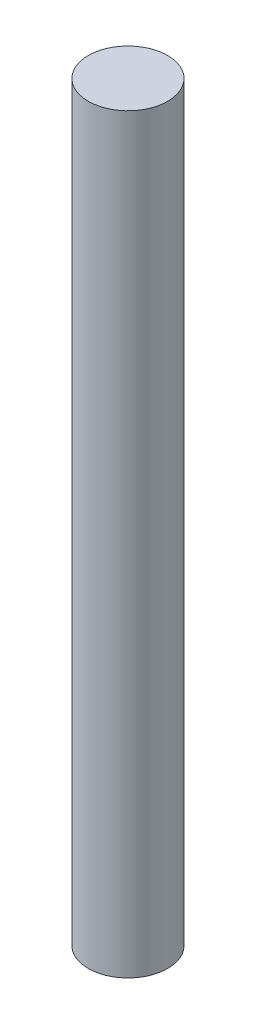
ISO-10303-21;
HEADER;
FILE_DESCRIPTION(('STEP AP214'),'2;1');
FILE_NAME('part.step','',(''),(''),'','','');
FILE_SCHEMA(('AUTOMOTIVE_DESIGN { 1 0 10303 214 1 1 1 1 }'));
ENDSEC;
DATA;
#1=APPLICATION_CONTEXT('core data for automotive mechanical design processes');
#2=APPLICATION_PROTOCOL_DEFINITION('international standard','automotive_design',2000,#1);
#3=PRODUCT_CONTEXT('',#1,'mechanical');
#4=PRODUCT('Part','Part','',(#3));
#5=PRODUCT_RELATED_PRODUCT_CATEGORY('part','',(#4));
#6=PRODUCT_DEFINITION_FORMATION('','',#4);
#7=PRODUCT_DEFINITION_CONTEXT('part definition',#1,'design');
#8=PRODUCT_DEFINITION('design','',#6,#7);
#9=PRODUCT_DEFINITION_SHAPE('','',#8);
#10=(LENGTH_UNIT() NAMED_UNIT(*) SI_UNIT(.MILLI.,.METRE.));
#11=(NAMED_UNIT(*) PLANE_ANGLE_UNIT() SI_UNIT($,.RADIAN.));
#12=(NAMED_UNIT(*) SI_UNIT($,.STERADIAN.) SOLID_ANGLE_UNIT());
#13=UNCERTAINTY_MEASURE_WITH_UNIT(LENGTH_MEASURE(1.E-05),#10,'distance_accuracy_value','');
#14=(GEOMETRIC_REPRESENTATION_CONTEXT(3) GLOBAL_UNCERTAINTY_ASSIGNED_CONTEXT((#13)) GLOBAL_UNIT_ASSIGNED_CONTEXT((#10,
#11,#12)) REPRESENTATION_CONTEXT('',''));
#15=CARTESIAN_POINT('',(0.,0.,0.));
#16=DIRECTION('',(0.,0.,1.));
#17=DIRECTION('',(1.,0.,0.));
#18=AXIS2_PLACEMENT_3D('',#15,#16,#17);
#19=CARTESIAN_POINT('',(0.,30.,0.));
#20=DIRECTION('',(0.,-1.,0.));
#21=DIRECTION('',(0.,0.,-1.));
#22=AXIS2_PLACEMENT_3D('',#19,#20,#21);
#23=CYLINDRICAL_SURFACE('',#22,1.585);
#24=CARTESIAN_POINT('',(0.,30.,0.));
#25=DIRECTION('',(0.,1.,0.));
#26=DIRECTION('',(0.,0.,1.));
#27=AXIS2_PLACEMENT_3D('',#24,#25,#26);
#28=CIRCLE('',#27,1.585);
#29=CARTESIAN_POINT('',(0.,30.,1.585));
#30=VERTEX_POINT('',#29);
#31=EDGE_CURVE('E10',#30,#30,#28,.T.);
#32=ORIENTED_EDGE('',*,*,#31,.F.);
#33=EDGE_LOOP('',(#32));
#34=FACE_BOUND('',#33,.T.);
#35=CARTESIAN_POINT('',(0.,0.,0.));
#36=DIRECTION('',(0.,1.,0.));
#37=DIRECTION('',(0.,0.,1.));
#38=AXIS2_PLACEMENT_3D('',#35,#36,#37);
#39=CIRCLE('',#38,1.585);
#40=CARTESIAN_POINT('',(0.,0.,1.585));
#41=VERTEX_POINT('',#40);
#42=EDGE_CURVE('E34',#41,#41,#39,.T.);
#43=ORIENTED_EDGE('',*,*,#42,.T.);
#44=EDGE_LOOP('',(#43));
#45=FACE_BOUND('',#44,.T.);
#46=ADVANCED_FACE('F31',(#34,#45),#23,.T.);
#47=CARTESIAN_POINT('',(0.,30.,0.));
#48=DIRECTION('',(0.,1.,0.));
#49=DIRECTION('',(0.,0.,1.));
#50=AXIS2_PLACEMENT_3D('',#47,#48,#49);
#51=PLANE('',#50);
#52=ORIENTED_EDGE('',*,*,#31,.T.);
#53=EDGE_LOOP('',(#52));
#54=FACE_BOUND('',#53,.T.);
#55=ADVANCED_FACE('F46',(#54),#51,.T.);
#56=CARTESIAN_POINT('',(0.,0.,0.));
#57=DIRECTION('',(0.,1.,0.));
#58=DIRECTION('',(0.,0.,1.));
#59=AXIS2_PLACEMENT_3D('',#56,#57,#58);
#60=PLANE('',#59);
#61=ORIENTED_EDGE('',*,*,#42,.F.);
#62=EDGE_LOOP('',(#61));
#63=FACE_BOUND('',#62,.T.);
#64=ADVANCED_FACE('F44',(#63),#60,.F.);
#65=CLOSED_SHELL('',(#46,#55,#64));
#66=MANIFOLD_SOLID_BREP('B2',#65);
#67=ADVANCED_BREP_SHAPE_REPRESENTATION('',(#18,#66),#14);
#68=SHAPE_DEFINITION_REPRESENTATION(#9,#67);
ENDSEC;
END-ISO-10303-21;
